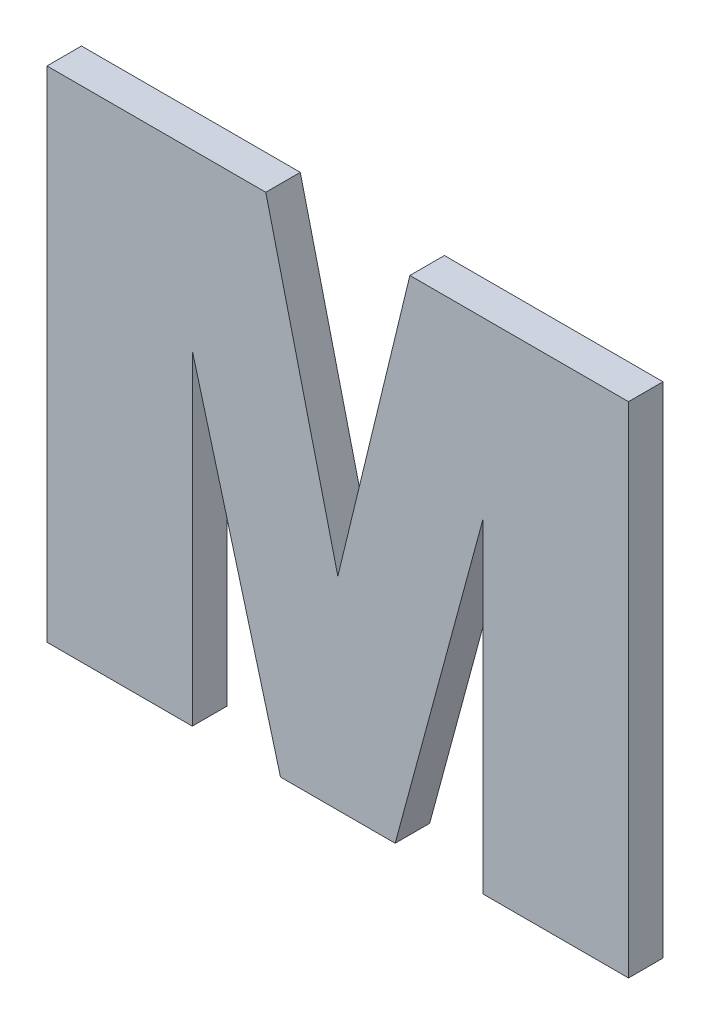
ISO-10303-21;
HEADER;
FILE_DESCRIPTION(('STEP AP214'),'2;1');
FILE_NAME('part.step','',(''),(''),'','','');
FILE_SCHEMA(('AUTOMOTIVE_DESIGN { 1 0 10303 214 1 1 1 1 }'));
ENDSEC;
DATA;
#1=APPLICATION_CONTEXT('core data for automotive mechanical design processes');
#2=APPLICATION_PROTOCOL_DEFINITION('international standard','automotive_design',2000,#1);
#3=PRODUCT_CONTEXT('',#1,'mechanical');
#4=PRODUCT('Part','Part','',(#3));
#5=PRODUCT_RELATED_PRODUCT_CATEGORY('part','',(#4));
#6=PRODUCT_DEFINITION_FORMATION('','',#4);
#7=PRODUCT_DEFINITION_CONTEXT('part definition',#1,'design');
#8=PRODUCT_DEFINITION('design','',#6,#7);
#9=PRODUCT_DEFINITION_SHAPE('','',#8);
#10=(LENGTH_UNIT() NAMED_UNIT(*) SI_UNIT(.MILLI.,.METRE.));
#11=(NAMED_UNIT(*) PLANE_ANGLE_UNIT() SI_UNIT($,.RADIAN.));
#12=(NAMED_UNIT(*) SI_UNIT($,.STERADIAN.) SOLID_ANGLE_UNIT());
#13=UNCERTAINTY_MEASURE_WITH_UNIT(LENGTH_MEASURE(1.E-05),#10,'distance_accuracy_value','');
#14=(GEOMETRIC_REPRESENTATION_CONTEXT(3) GLOBAL_UNCERTAINTY_ASSIGNED_CONTEXT((#13)) GLOBAL_UNIT_ASSIGNED_CONTEXT((#10,
#11,#12)) REPRESENTATION_CONTEXT('',''));
#15=CARTESIAN_POINT('',(0.,0.,0.));
#16=DIRECTION('',(0.,0.,1.));
#17=DIRECTION('',(1.,0.,0.));
#18=AXIS2_PLACEMENT_3D('',#15,#16,#17);
#19=CARTESIAN_POINT('',(0.,0.,0.05));
#20=DIRECTION('',(0.,0.,1.));
#21=DIRECTION('',(1.,0.,0.));
#22=AXIS2_PLACEMENT_3D('',#19,#20,#21);
#23=PLANE('',#22);
#24=DIRECTION('',(0.,1.,0.));
#25=VECTOR('',#24,1.);
#26=CARTESIAN_POINT('',(3.181096,0.654558,0.05));
#27=LINE('',#26,#25);
#28=CARTESIAN_POINT('',(3.181096,1.377696,0.05));
#29=VERTEX_POINT('',#28);
#30=CARTESIAN_POINT('',(3.181096,0.654558,0.05));
#31=VERTEX_POINT('',#30);
#32=EDGE_CURVE('E124',#29,#31,#27,.F.);
#33=ORIENTED_EDGE('',*,*,#32,.F.);
#34=DIRECTION('',(1.,0.,0.));
#35=VECTOR('',#34,1.);
#36=CARTESIAN_POINT('',(3.181096,1.377696,0.05));
#37=LINE('',#36,#35);
#38=CARTESIAN_POINT('',(2.864358,1.377696,0.05));
#39=VERTEX_POINT('',#38);
#40=EDGE_CURVE('E20',#39,#29,#37,.T.);
#41=ORIENTED_EDGE('',*,*,#40,.F.);
#42=DIRECTION('',(-0.23611471723681,-0.971725187645242,0.));
#43=VECTOR('',#42,1.);
#44=CARTESIAN_POINT('',(2.864358,1.377696,0.05));
#45=LINE('',#44,#43);
#46=CARTESIAN_POINT('',(2.759964,0.9480646732187,0.05));
#47=VERTEX_POINT('',#46);
#48=EDGE_CURVE('E113',#47,#39,#45,.F.);
#49=ORIENTED_EDGE('',*,*,#48,.F.);
#50=DIRECTION('',(-0.23611471723681,0.971725187645242,0.));
#51=VECTOR('',#50,1.);
#52=CARTESIAN_POINT('',(2.759964,0.9480646732187,0.05));
#53=LINE('',#52,#51);
#54=CARTESIAN_POINT('',(2.65557,1.377696,0.05));
#55=VERTEX_POINT('',#54);
#56=EDGE_CURVE('E108',#55,#47,#53,.F.);
#57=ORIENTED_EDGE('',*,*,#56,.F.);
#58=DIRECTION('',(1.,0.,0.));
#59=VECTOR('',#58,1.);
#60=CARTESIAN_POINT('',(2.65557,1.377696,0.05));
#61=LINE('',#60,#59);
#62=CARTESIAN_POINT('',(2.338578,1.377696,0.05));
#63=VERTEX_POINT('',#62);
#64=EDGE_CURVE('E135',#63,#55,#61,.T.);
#65=ORIENTED_EDGE('',*,*,#64,.F.);
#66=DIRECTION('',(0.,1.,0.));
#67=VECTOR('',#66,1.);
#68=CARTESIAN_POINT('',(2.338578,1.377696,0.05));
#69=LINE('',#68,#67);
#70=CARTESIAN_POINT('',(2.338578,0.654558,0.05));
#71=VERTEX_POINT('',#70);
#72=EDGE_CURVE('E139',#71,#63,#69,.T.);
#73=ORIENTED_EDGE('',*,*,#72,.F.);
#74=DIRECTION('',(1.,0.,0.));
#75=VECTOR('',#74,1.);
#76=CARTESIAN_POINT('',(2.338578,0.654558,0.05));
#77=LINE('',#76,#75);
#78=CARTESIAN_POINT('',(2.549144,0.654558,0.05));
#79=VERTEX_POINT('',#78);
#80=EDGE_CURVE('E143',#79,#71,#77,.F.);
#81=ORIENTED_EDGE('',*,*,#80,.F.);
#82=DIRECTION('',(0.,1.,0.));
#83=VECTOR('',#82,1.);
#84=CARTESIAN_POINT('',(2.549144,0.654558,0.05));
#85=LINE('',#84,#83);
#86=CARTESIAN_POINT('',(2.549144,1.125857822222,0.05));
#87=VERTEX_POINT('',#86);
#88=EDGE_CURVE('E147',#87,#79,#85,.F.);
#89=ORIENTED_EDGE('',*,*,#88,.F.);
#90=DIRECTION('',(0.261641173327109,-0.965165217162333,0.));
#91=VECTOR('',#90,1.);
#92=CARTESIAN_POINT('',(2.549144,1.125857822222,0.05));
#93=LINE('',#92,#91);
#94=CARTESIAN_POINT('',(2.67690599999998,0.654557999999995,0.05));
#95=VERTEX_POINT('',#94);
#96=EDGE_CURVE('E151',#95,#87,#93,.F.);
#97=ORIENTED_EDGE('',*,*,#96,.F.);
#98=DIRECTION('',(1.,0.,0.));
#99=VECTOR('',#98,1.);
#100=CARTESIAN_POINT('',(2.676906,0.654558,0.05));
#101=LINE('',#100,#99);
#102=CARTESIAN_POINT('',(2.843022,0.654558,0.05));
#103=VERTEX_POINT('',#102);
#104=EDGE_CURVE('E155',#103,#95,#101,.F.);
#105=ORIENTED_EDGE('',*,*,#104,.F.);
#106=DIRECTION('',(0.261148686911513,0.965298587652749,0.));
#107=VECTOR('',#106,1.);
#108=CARTESIAN_POINT('',(2.843022,0.654558,0.05));
#109=LINE('',#108,#107);
#110=CARTESIAN_POINT('',(2.97052999999997,1.12587299595101,0.05));
#111=VERTEX_POINT('',#110);
#112=EDGE_CURVE('E159',#111,#103,#109,.F.);
#113=ORIENTED_EDGE('',*,*,#112,.F.);
#114=DIRECTION('',(0.,1.,0.));
#115=VECTOR('',#114,1.);
#116=CARTESIAN_POINT('',(2.97053,1.125872995951,0.05));
#117=LINE('',#116,#115);
#118=CARTESIAN_POINT('',(2.97053,0.654558,0.05));
#119=VERTEX_POINT('',#118);
#120=EDGE_CURVE('E163',#119,#111,#117,.T.);
#121=ORIENTED_EDGE('',*,*,#120,.F.);
#122=DIRECTION('',(1.,0.,0.));
#123=VECTOR('',#122,1.);
#124=CARTESIAN_POINT('',(2.97053,0.654558,0.05));
#125=LINE('',#124,#123);
#126=EDGE_CURVE('E167',#31,#119,#125,.F.);
#127=ORIENTED_EDGE('',*,*,#126,.F.);
#128=EDGE_LOOP('',(#33,#41,#49,#57,#65,#73,#81,#89,#97,#105,#113,#121,#127));
#129=FACE_BOUND('',#128,.T.);
#130=ADVANCED_FACE('F17',(#129),#23,.T.);
#131=CARTESIAN_POINT('',(3.181096,1.377696,0.));
#132=DIRECTION('',(0.,1.,0.));
#133=DIRECTION('',(0.,0.,1.));
#134=AXIS2_PLACEMENT_3D('',#131,#132,#133);
#135=PLANE('',#134);
#136=DIRECTION('',(0.,0.,-1.));
#137=VECTOR('',#136,1.);
#138=CARTESIAN_POINT('',(3.181096,1.377696,0.));
#139=LINE('',#138,#137);
#140=CARTESIAN_POINT('',(3.181096,1.377696,0.));
#141=VERTEX_POINT('',#140);
#142=EDGE_CURVE('E171',#141,#29,#139,.F.);
#143=ORIENTED_EDGE('',*,*,#142,.F.);
#144=DIRECTION('',(1.,0.,0.));
#145=VECTOR('',#144,1.);
#146=CARTESIAN_POINT('',(0.,1.377696,0.));
#147=LINE('',#146,#145);
#148=CARTESIAN_POINT('',(2.864358,1.377696,0.));
#149=VERTEX_POINT('',#148);
#150=EDGE_CURVE('E130',#141,#149,#147,.F.);
#151=ORIENTED_EDGE('',*,*,#150,.T.);
#152=DIRECTION('',(0.,0.,1.));
#153=VECTOR('',#152,1.);
#154=CARTESIAN_POINT('',(2.864358,1.377696,0.));
#155=LINE('',#154,#153);
#156=EDGE_CURVE('E118',#39,#149,#155,.F.);
#157=ORIENTED_EDGE('',*,*,#156,.F.);
#158=ORIENTED_EDGE('',*,*,#40,.T.);
#159=EDGE_LOOP('',(#143,#151,#157,#158));
#160=FACE_BOUND('',#159,.T.);
#161=ADVANCED_FACE('F129',(#160),#135,.T.);
#162=CARTESIAN_POINT('',(2.864358,1.377696,0.));
#163=DIRECTION('',(-0.971725187645242,0.23611471723681,0.));
#164=DIRECTION('',(-0.23611471723681,-0.971725187645242,0.));
#165=AXIS2_PLACEMENT_3D('',#162,#163,#164);
#166=PLANE('',#165);
#167=ORIENTED_EDGE('',*,*,#156,.T.);
#168=DIRECTION('',(-0.2361147172368,-0.971725187645245,0.));
#169=VECTOR('',#168,1.);
#170=CARTESIAN_POINT('',(2.864358,1.377696,0.));
#171=LINE('',#170,#169);
#172=CARTESIAN_POINT('',(2.759964,0.948064673218701,0.));
#173=VERTEX_POINT('',#172);
#174=EDGE_CURVE('E176',#149,#173,#171,.T.);
#175=ORIENTED_EDGE('',*,*,#174,.T.);
#176=DIRECTION('',(0.,0.,1.));
#177=VECTOR('',#176,1.);
#178=CARTESIAN_POINT('',(2.759964,0.9480646732187,0.));
#179=LINE('',#178,#177);
#180=EDGE_CURVE('E120',#47,#173,#179,.F.);
#181=ORIENTED_EDGE('',*,*,#180,.F.);
#182=ORIENTED_EDGE('',*,*,#48,.T.);
#183=EDGE_LOOP('',(#167,#175,#181,#182));
#184=FACE_BOUND('',#183,.T.);
#185=ADVANCED_FACE('F115',(#184),#166,.T.);
#186=CARTESIAN_POINT('',(2.759964,0.9480646732187,0.));
#187=DIRECTION('',(0.971725187645242,0.23611471723681,0.));
#188=DIRECTION('',(-0.23611471723681,0.971725187645242,0.));
#189=AXIS2_PLACEMENT_3D('',#186,#187,#188);
#190=PLANE('',#189);
#191=ORIENTED_EDGE('',*,*,#180,.T.);
#192=DIRECTION('',(-0.2361147172368,0.971725187645245,0.));
#193=VECTOR('',#192,1.);
#194=CARTESIAN_POINT('',(2.759964,0.9480646732187,0.));
#195=LINE('',#194,#193);
#196=CARTESIAN_POINT('',(2.65557,1.377696,0.));
#197=VERTEX_POINT('',#196);
#198=EDGE_CURVE('E178',#173,#197,#195,.T.);
#199=ORIENTED_EDGE('',*,*,#198,.T.);
#200=DIRECTION('',(0.,0.,1.));
#201=VECTOR('',#200,1.);
#202=CARTESIAN_POINT('',(2.65557,1.377696,0.));
#203=LINE('',#202,#201);
#204=EDGE_CURVE('E137',#55,#197,#203,.F.);
#205=ORIENTED_EDGE('',*,*,#204,.F.);
#206=ORIENTED_EDGE('',*,*,#56,.T.);
#207=EDGE_LOOP('',(#191,#199,#205,#206));
#208=FACE_BOUND('',#207,.T.);
#209=ADVANCED_FACE('F252',(#208),#190,.T.);
#210=CARTESIAN_POINT('',(2.65557,1.377696,0.));
#211=DIRECTION('',(0.,1.,0.));
#212=DIRECTION('',(0.,0.,1.));
#213=AXIS2_PLACEMENT_3D('',#210,#211,#212);
#214=PLANE('',#213);
#215=ORIENTED_EDGE('',*,*,#204,.T.);
#216=DIRECTION('',(1.,0.,0.));
#217=VECTOR('',#216,1.);
#218=CARTESIAN_POINT('',(0.,1.377696,0.));
#219=LINE('',#218,#217);
#220=CARTESIAN_POINT('',(2.338578,1.377696,0.));
#221=VERTEX_POINT('',#220);
#222=EDGE_CURVE('E181',#197,#221,#219,.F.);
#223=ORIENTED_EDGE('',*,*,#222,.T.);
#224=DIRECTION('',(0.,0.,1.));
#225=VECTOR('',#224,1.);
#226=CARTESIAN_POINT('',(2.338578,1.377696,0.));
#227=LINE('',#226,#225);
#228=EDGE_CURVE('E141',#63,#221,#227,.F.);
#229=ORIENTED_EDGE('',*,*,#228,.F.);
#230=ORIENTED_EDGE('',*,*,#64,.T.);
#231=EDGE_LOOP('',(#215,#223,#229,#230));
#232=FACE_BOUND('',#231,.T.);
#233=ADVANCED_FACE('F250',(#232),#214,.T.);
#234=CARTESIAN_POINT('',(2.338578,1.377696,0.));
#235=DIRECTION('',(-1.,0.,0.));
#236=DIRECTION('',(0.,0.,1.));
#237=AXIS2_PLACEMENT_3D('',#234,#235,#236);
#238=PLANE('',#237);
#239=ORIENTED_EDGE('',*,*,#228,.T.);
#240=DIRECTION('',(0.,1.,0.));
#241=VECTOR('',#240,1.);
#242=CARTESIAN_POINT('',(2.338578,0.,0.));
#243=LINE('',#242,#241);
#244=CARTESIAN_POINT('',(2.338578,0.654558,0.));
#245=VERTEX_POINT('',#244);
#246=EDGE_CURVE('E184',#221,#245,#243,.F.);
#247=ORIENTED_EDGE('',*,*,#246,.T.);
#248=DIRECTION('',(0.,0.,-1.));
#249=VECTOR('',#248,1.);
#250=CARTESIAN_POINT('',(2.338578,0.654558,0.));
#251=LINE('',#250,#249);
#252=EDGE_CURVE('E145',#71,#245,#251,.T.);
#253=ORIENTED_EDGE('',*,*,#252,.F.);
#254=ORIENTED_EDGE('',*,*,#72,.T.);
#255=EDGE_LOOP('',(#239,#247,#253,#254));
#256=FACE_BOUND('',#255,.T.);
#257=ADVANCED_FACE('F246',(#256),#238,.T.);
#258=CARTESIAN_POINT('',(2.338578,0.654558,0.));
#259=DIRECTION('',(0.,-1.,0.));
#260=DIRECTION('',(0.,0.,-1.));
#261=AXIS2_PLACEMENT_3D('',#258,#259,#260);
#262=PLANE('',#261);
#263=ORIENTED_EDGE('',*,*,#252,.T.);
#264=DIRECTION('',(1.,0.,0.));
#265=VECTOR('',#264,1.);
#266=CARTESIAN_POINT('',(0.,0.654558,0.));
#267=LINE('',#266,#265);
#268=CARTESIAN_POINT('',(2.549144,0.654558,0.));
#269=VERTEX_POINT('',#268);
#270=EDGE_CURVE('E187',#245,#269,#267,.T.);
#271=ORIENTED_EDGE('',*,*,#270,.T.);
#272=DIRECTION('',(0.,0.,-1.));
#273=VECTOR('',#272,1.);
#274=CARTESIAN_POINT('',(2.549144,0.654558,0.));
#275=LINE('',#274,#273);
#276=EDGE_CURVE('E149',#79,#269,#275,.T.);
#277=ORIENTED_EDGE('',*,*,#276,.F.);
#278=ORIENTED_EDGE('',*,*,#80,.T.);
#279=EDGE_LOOP('',(#263,#271,#277,#278));
#280=FACE_BOUND('',#279,.T.);
#281=ADVANCED_FACE('F240',(#280),#262,.T.);
#282=CARTESIAN_POINT('',(2.549144,0.654558,0.));
#283=DIRECTION('',(1.,0.,0.));
#284=DIRECTION('',(0.,0.,-1.));
#285=AXIS2_PLACEMENT_3D('',#282,#283,#284);
#286=PLANE('',#285);
#287=ORIENTED_EDGE('',*,*,#276,.T.);
#288=DIRECTION('',(0.,1.,0.));
#289=VECTOR('',#288,1.);
#290=CARTESIAN_POINT('',(2.549144,0.,0.));
#291=LINE('',#290,#289);
#292=CARTESIAN_POINT('',(2.549144,1.125857822222,0.));
#293=VERTEX_POINT('',#292);
#294=EDGE_CURVE('E190',#269,#293,#291,.T.);
#295=ORIENTED_EDGE('',*,*,#294,.T.);
#296=DIRECTION('',(0.,0.,1.));
#297=VECTOR('',#296,1.);
#298=CARTESIAN_POINT('',(2.549144,1.125857822222,0.));
#299=LINE('',#298,#297);
#300=EDGE_CURVE('E153',#87,#293,#299,.F.);
#301=ORIENTED_EDGE('',*,*,#300,.F.);
#302=ORIENTED_EDGE('',*,*,#88,.T.);
#303=EDGE_LOOP('',(#287,#295,#301,#302));
#304=FACE_BOUND('',#303,.T.);
#305=ADVANCED_FACE('F236',(#304),#286,.T.);
#306=CARTESIAN_POINT('',(2.549144,1.125857822222,0.));
#307=DIRECTION('',(-0.965165217162333,-0.261641173327109,0.));
#308=DIRECTION('',(0.261641173327109,-0.965165217162333,0.));
#309=AXIS2_PLACEMENT_3D('',#306,#307,#308);
#310=PLANE('',#309);
#311=ORIENTED_EDGE('',*,*,#300,.T.);
#312=DIRECTION('',(0.261641173327251,-0.965165217162295,0.));
#313=VECTOR('',#312,1.);
#314=CARTESIAN_POINT('',(2.549144,1.125857822222,0.));
#315=LINE('',#314,#313);
#316=CARTESIAN_POINT('',(2.67690599999997,0.654557999999991,0.));
#317=VERTEX_POINT('',#316);
#318=EDGE_CURVE('E193',#293,#317,#315,.T.);
#319=ORIENTED_EDGE('',*,*,#318,.T.);
#320=DIRECTION('',(0.,0.,-1.));
#321=VECTOR('',#320,1.);
#322=CARTESIAN_POINT('',(2.676906,0.654558,0.));
#323=LINE('',#322,#321);
#324=EDGE_CURVE('E157',#95,#317,#323,.T.);
#325=ORIENTED_EDGE('',*,*,#324,.F.);
#326=ORIENTED_EDGE('',*,*,#96,.T.);
#327=EDGE_LOOP('',(#311,#319,#325,#326));
#328=FACE_BOUND('',#327,.T.);
#329=ADVANCED_FACE('F230',(#328),#310,.T.);
#330=CARTESIAN_POINT('',(2.676906,0.654558,0.));
#331=DIRECTION('',(0.,-1.,0.));
#332=DIRECTION('',(0.,0.,-1.));
#333=AXIS2_PLACEMENT_3D('',#330,#331,#332);
#334=PLANE('',#333);
#335=ORIENTED_EDGE('',*,*,#324,.T.);
#336=DIRECTION('',(1.,0.,0.));
#337=VECTOR('',#336,1.);
#338=CARTESIAN_POINT('',(0.,0.654558,0.));
#339=LINE('',#338,#337);
#340=CARTESIAN_POINT('',(2.843022,0.654558,0.));
#341=VERTEX_POINT('',#340);
#342=EDGE_CURVE('E196',#317,#341,#339,.T.);
#343=ORIENTED_EDGE('',*,*,#342,.T.);
#344=DIRECTION('',(0.,0.,1.));
#345=VECTOR('',#344,1.);
#346=CARTESIAN_POINT('',(2.843022,0.654558,0.));
#347=LINE('',#346,#345);
#348=EDGE_CURVE('E161',#103,#341,#347,.F.);
#349=ORIENTED_EDGE('',*,*,#348,.F.);
#350=ORIENTED_EDGE('',*,*,#104,.T.);
#351=EDGE_LOOP('',(#335,#343,#349,#350));
#352=FACE_BOUND('',#351,.T.);
#353=ADVANCED_FACE('F226',(#352),#334,.T.);
#354=CARTESIAN_POINT('',(2.843022,0.654558,0.));
#355=DIRECTION('',(0.965298587652749,-0.261148686911513,0.));
#356=DIRECTION('',(0.261148686911513,0.965298587652749,0.));
#357=AXIS2_PLACEMENT_3D('',#354,#355,#356);
#358=PLANE('',#357);
#359=ORIENTED_EDGE('',*,*,#348,.T.);
#360=DIRECTION('',(0.261148686911747,0.965298587652686,0.));
#361=VECTOR('',#360,1.);
#362=CARTESIAN_POINT('',(2.843022,0.654558,0.));
#363=LINE('',#362,#361);
#364=CARTESIAN_POINT('',(2.97052999999994,1.12587299595102,0.));
#365=VERTEX_POINT('',#364);
#366=EDGE_CURVE('E199',#341,#365,#363,.T.);
#367=ORIENTED_EDGE('',*,*,#366,.T.);
#368=DIRECTION('',(0.,0.,1.));
#369=VECTOR('',#368,1.);
#370=CARTESIAN_POINT('',(2.97053,1.125872995951,0.));
#371=LINE('',#370,#369);
#372=EDGE_CURVE('E165',#111,#365,#371,.F.);
#373=ORIENTED_EDGE('',*,*,#372,.F.);
#374=ORIENTED_EDGE('',*,*,#112,.T.);
#375=EDGE_LOOP('',(#359,#367,#373,#374));
#376=FACE_BOUND('',#375,.T.);
#377=ADVANCED_FACE('F220',(#376),#358,.T.);
#378=CARTESIAN_POINT('',(2.97053,1.125872995951,0.));
#379=DIRECTION('',(-1.,0.,0.));
#380=DIRECTION('',(0.,0.,1.));
#381=AXIS2_PLACEMENT_3D('',#378,#379,#380);
#382=PLANE('',#381);
#383=ORIENTED_EDGE('',*,*,#372,.T.);
#384=DIRECTION('',(0.,1.,0.));
#385=VECTOR('',#384,1.);
#386=CARTESIAN_POINT('',(2.97053,0.,0.));
#387=LINE('',#386,#385);
#388=CARTESIAN_POINT('',(2.97053,0.654558,0.));
#389=VERTEX_POINT('',#388);
#390=EDGE_CURVE('E202',#365,#389,#387,.F.);
#391=ORIENTED_EDGE('',*,*,#390,.T.);
#392=DIRECTION('',(0.,0.,-1.));
#393=VECTOR('',#392,1.);
#394=CARTESIAN_POINT('',(2.97053,0.654558,0.));
#395=LINE('',#394,#393);
#396=EDGE_CURVE('E169',#119,#389,#395,.T.);
#397=ORIENTED_EDGE('',*,*,#396,.F.);
#398=ORIENTED_EDGE('',*,*,#120,.T.);
#399=EDGE_LOOP('',(#383,#391,#397,#398));
#400=FACE_BOUND('',#399,.T.);
#401=ADVANCED_FACE('F215',(#400),#382,.T.);
#402=CARTESIAN_POINT('',(2.97053,0.654558,0.));
#403=DIRECTION('',(0.,-1.,0.));
#404=DIRECTION('',(0.,0.,-1.));
#405=AXIS2_PLACEMENT_3D('',#402,#403,#404);
#406=PLANE('',#405);
#407=ORIENTED_EDGE('',*,*,#396,.T.);
#408=DIRECTION('',(1.,0.,0.));
#409=VECTOR('',#408,1.);
#410=CARTESIAN_POINT('',(0.,0.654558,0.));
#411=LINE('',#410,#409);
#412=CARTESIAN_POINT('',(3.181096,0.654558,0.));
#413=VERTEX_POINT('',#412);
#414=EDGE_CURVE('E26',#389,#413,#411,.T.);
#415=ORIENTED_EDGE('',*,*,#414,.T.);
#416=DIRECTION('',(0.,0.,-1.));
#417=VECTOR('',#416,1.);
#418=CARTESIAN_POINT('',(3.181096,0.654558,0.));
#419=LINE('',#418,#417);
#420=EDGE_CURVE('E34',#31,#413,#419,.T.);
#421=ORIENTED_EDGE('',*,*,#420,.F.);
#422=ORIENTED_EDGE('',*,*,#126,.T.);
#423=EDGE_LOOP('',(#407,#415,#421,#422));
#424=FACE_BOUND('',#423,.T.);
#425=ADVANCED_FACE('F208',(#424),#406,.T.);
#426=CARTESIAN_POINT('',(3.181096,0.654558,0.));
#427=DIRECTION('',(1.,0.,0.));
#428=DIRECTION('',(0.,0.,-1.));
#429=AXIS2_PLACEMENT_3D('',#426,#427,#428);
#430=PLANE('',#429);
#431=ORIENTED_EDGE('',*,*,#420,.T.);
#432=DIRECTION('',(0.,1.,0.));
#433=VECTOR('',#432,1.);
#434=CARTESIAN_POINT('',(3.181096,0.,0.));
#435=LINE('',#434,#433);
#436=EDGE_CURVE('E11',#413,#141,#435,.T.);
#437=ORIENTED_EDGE('',*,*,#436,.T.);
#438=ORIENTED_EDGE('',*,*,#142,.T.);
#439=ORIENTED_EDGE('',*,*,#32,.T.);
#440=EDGE_LOOP('',(#431,#437,#438,#439));
#441=FACE_BOUND('',#440,.T.);
#442=ADVANCED_FACE('F263',(#441),#430,.T.);
#443=CARTESIAN_POINT('',(0.,0.,0.));
#444=DIRECTION('',(0.,0.,1.));
#445=DIRECTION('',(1.,0.,0.));
#446=AXIS2_PLACEMENT_3D('',#443,#444,#445);
#447=PLANE('',#446);
#448=ORIENTED_EDGE('',*,*,#414,.F.);
#449=ORIENTED_EDGE('',*,*,#390,.F.);
#450=ORIENTED_EDGE('',*,*,#366,.F.);
#451=ORIENTED_EDGE('',*,*,#342,.F.);
#452=ORIENTED_EDGE('',*,*,#318,.F.);
#453=ORIENTED_EDGE('',*,*,#294,.F.);
#454=ORIENTED_EDGE('',*,*,#270,.F.);
#455=ORIENTED_EDGE('',*,*,#246,.F.);
#456=ORIENTED_EDGE('',*,*,#222,.F.);
#457=ORIENTED_EDGE('',*,*,#198,.F.);
#458=ORIENTED_EDGE('',*,*,#174,.F.);
#459=ORIENTED_EDGE('',*,*,#150,.F.);
#460=ORIENTED_EDGE('',*,*,#436,.F.);
#461=EDGE_LOOP('',(#448,#449,#450,#451,#452,#453,#454,#455,#456,#457,#458,#459,#460));
#462=FACE_BOUND('',#461,.T.);
#463=ADVANCED_FACE('F212',(#462),#447,.F.);
#464=CLOSED_SHELL('',(#130,#161,#185,#209,#233,#257,#281,#305,#329,#353,#377,#401,#425,#442,#463));
#465=MANIFOLD_SOLID_BREP('B1',#464);
#466=ADVANCED_BREP_SHAPE_REPRESENTATION('',(#18,#465),#14);
#467=SHAPE_DEFINITION_REPRESENTATION(#9,#466);
ENDSEC;
END-ISO-10303-21;
